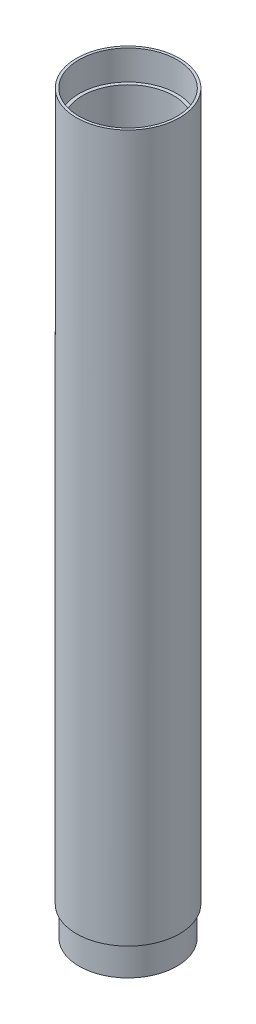
ISO-10303-21;
HEADER;
FILE_DESCRIPTION(('STEP AP214'),'2;1');
FILE_NAME('part.step','',(''),(''),'','','');
FILE_SCHEMA(('AUTOMOTIVE_DESIGN { 1 0 10303 214 1 1 1 1 }'));
ENDSEC;
DATA;
#1=APPLICATION_CONTEXT('core data for automotive mechanical design processes');
#2=APPLICATION_PROTOCOL_DEFINITION('international standard','automotive_design',2000,#1);
#3=PRODUCT_CONTEXT('',#1,'mechanical');
#4=PRODUCT('Part','Part','',(#3));
#5=PRODUCT_RELATED_PRODUCT_CATEGORY('part','',(#4));
#6=PRODUCT_DEFINITION_FORMATION('','',#4);
#7=PRODUCT_DEFINITION_CONTEXT('part definition',#1,'design');
#8=PRODUCT_DEFINITION('design','',#6,#7);
#9=PRODUCT_DEFINITION_SHAPE('','',#8);
#10=(LENGTH_UNIT() NAMED_UNIT(*) SI_UNIT(.MILLI.,.METRE.));
#11=(NAMED_UNIT(*) PLANE_ANGLE_UNIT() SI_UNIT($,.RADIAN.));
#12=(NAMED_UNIT(*) SI_UNIT($,.STERADIAN.) SOLID_ANGLE_UNIT());
#13=UNCERTAINTY_MEASURE_WITH_UNIT(LENGTH_MEASURE(1.E-05),#10,'distance_accuracy_value','');
#14=(GEOMETRIC_REPRESENTATION_CONTEXT(3) GLOBAL_UNCERTAINTY_ASSIGNED_CONTEXT((#13)) GLOBAL_UNIT_ASSIGNED_CONTEXT((#10,
#11,#12)) REPRESENTATION_CONTEXT('',''));
#15=CARTESIAN_POINT('',(0.,0.,0.));
#16=DIRECTION('',(0.,0.,1.));
#17=DIRECTION('',(1.,0.,0.));
#18=AXIS2_PLACEMENT_3D('',#15,#16,#17);
#19=CARTESIAN_POINT('',(0.,0.,0.));
#20=DIRECTION('',(0.,1.,0.));
#21=DIRECTION('',(0.,0.,1.));
#22=AXIS2_PLACEMENT_3D('',#19,#20,#21);
#23=PLANE('',#22);
#24=CARTESIAN_POINT('',(0.,0.,0.));
#25=DIRECTION('',(0.,1.,0.));
#26=DIRECTION('',(0.,0.,1.));
#27=AXIS2_PLACEMENT_3D('',#24,#25,#26);
#28=CIRCLE('',#27,15.5);
#29=CARTESIAN_POINT('',(0.,0.,15.5));
#30=VERTEX_POINT('',#29);
#31=EDGE_CURVE('E53',#30,#30,#28,.T.);
#32=ORIENTED_EDGE('',*,*,#31,.T.);
#33=EDGE_LOOP('',(#32));
#34=FACE_BOUND('',#33,.T.);
#35=CARTESIAN_POINT('',(0.,0.,0.));
#36=DIRECTION('',(0.,-1.,0.));
#37=DIRECTION('',(0.,0.,-1.));
#38=AXIS2_PLACEMENT_3D('',#35,#36,#37);
#39=CIRCLE('',#38,16.6);
#40=CARTESIAN_POINT('',(0.,0.,-16.6));
#41=VERTEX_POINT('',#40);
#42=EDGE_CURVE('E73',#41,#41,#39,.T.);
#43=ORIENTED_EDGE('',*,*,#42,.T.);
#44=EDGE_LOOP('',(#43));
#45=FACE_BOUND('',#44,.T.);
#46=ADVANCED_FACE('F40',(#34,#45),#23,.F.);
#47=CARTESIAN_POINT('',(0.,240.,0.));
#48=DIRECTION('',(0.,-1.,0.));
#49=DIRECTION('',(0.,0.,-1.));
#50=AXIS2_PLACEMENT_3D('',#47,#48,#49);
#51=CYLINDRICAL_SURFACE('',#50,17.5);
#52=CARTESIAN_POINT('',(0.,250.,0.));
#53=DIRECTION('',(0.,1.,0.));
#54=DIRECTION('',(0.,0.,1.));
#55=AXIS2_PLACEMENT_3D('',#52,#53,#54);
#56=CIRCLE('',#55,17.5);
#57=CARTESIAN_POINT('',(0.,250.,17.5));
#58=VERTEX_POINT('',#57);
#59=EDGE_CURVE('E59',#58,#58,#56,.T.);
#60=ORIENTED_EDGE('',*,*,#59,.F.);
#61=EDGE_LOOP('',(#60));
#62=FACE_BOUND('',#61,.T.);
#63=CARTESIAN_POINT('',(0.,10.,0.));
#64=DIRECTION('',(0.,-1.,0.));
#65=DIRECTION('',(0.,0.,-1.));
#66=AXIS2_PLACEMENT_3D('',#63,#64,#65);
#67=CIRCLE('',#66,17.5);
#68=CARTESIAN_POINT('',(0.,10.,-17.5));
#69=VERTEX_POINT('',#68);
#70=EDGE_CURVE('E68',#69,#69,#67,.T.);
#71=ORIENTED_EDGE('',*,*,#70,.F.);
#72=EDGE_LOOP('',(#71));
#73=FACE_BOUND('',#72,.T.);
#74=ADVANCED_FACE('F42',(#62,#73),#51,.T.);
#75=CARTESIAN_POINT('',(0.,240.,0.));
#76=DIRECTION('',(0.,1.,0.));
#77=DIRECTION('',(0.,0.,1.));
#78=AXIS2_PLACEMENT_3D('',#75,#76,#77);
#79=PLANE('',#78);
#80=CARTESIAN_POINT('',(0.,240.,0.));
#81=DIRECTION('',(0.,1.,0.));
#82=DIRECTION('',(0.,0.,1.));
#83=AXIS2_PLACEMENT_3D('',#80,#81,#82);
#84=CIRCLE('',#83,15.5);
#85=CARTESIAN_POINT('',(0.,240.,15.5));
#86=VERTEX_POINT('',#85);
#87=EDGE_CURVE('E48',#86,#86,#84,.T.);
#88=ORIENTED_EDGE('',*,*,#87,.F.);
#89=EDGE_LOOP('',(#88));
#90=FACE_BOUND('',#89,.T.);
#91=CARTESIAN_POINT('',(0.,240.,0.));
#92=DIRECTION('',(0.,1.,0.));
#93=DIRECTION('',(0.,0.,1.));
#94=AXIS2_PLACEMENT_3D('',#91,#92,#93);
#95=CIRCLE('',#94,16.65);
#96=CARTESIAN_POINT('',(0.,240.,16.65));
#97=VERTEX_POINT('',#96);
#98=EDGE_CURVE('E10',#97,#97,#95,.F.);
#99=ORIENTED_EDGE('',*,*,#98,.F.);
#100=EDGE_LOOP('',(#99));
#101=FACE_BOUND('',#100,.T.);
#102=ADVANCED_FACE('F92',(#90,#101),#79,.T.);
#103=CARTESIAN_POINT('',(0.,240.,0.));
#104=DIRECTION('',(0.,-1.,0.));
#105=DIRECTION('',(0.,0.,-1.));
#106=AXIS2_PLACEMENT_3D('',#103,#104,#105);
#107=CYLINDRICAL_SURFACE('',#106,15.5);
#108=ORIENTED_EDGE('',*,*,#87,.T.);
#109=EDGE_LOOP('',(#108));
#110=FACE_BOUND('',#109,.T.);
#111=ORIENTED_EDGE('',*,*,#31,.F.);
#112=EDGE_LOOP('',(#111));
#113=FACE_BOUND('',#112,.T.);
#114=ADVANCED_FACE('F98',(#110,#113),#107,.F.);
#115=CARTESIAN_POINT('',(0.,250.,0.));
#116=DIRECTION('',(0.,1.,0.));
#117=DIRECTION('',(0.,0.,1.));
#118=AXIS2_PLACEMENT_3D('',#115,#116,#117);
#119=PLANE('',#118);
#120=ORIENTED_EDGE('',*,*,#59,.T.);
#121=EDGE_LOOP('',(#120));
#122=FACE_BOUND('',#121,.T.);
#123=CARTESIAN_POINT('',(0.,250.,0.));
#124=DIRECTION('',(0.,1.,0.));
#125=DIRECTION('',(0.,0.,1.));
#126=AXIS2_PLACEMENT_3D('',#123,#124,#125);
#127=CIRCLE('',#126,16.65);
#128=CARTESIAN_POINT('',(0.,250.,16.65));
#129=VERTEX_POINT('',#128);
#130=EDGE_CURVE('E64',#129,#129,#127,.T.);
#131=ORIENTED_EDGE('',*,*,#130,.F.);
#132=EDGE_LOOP('',(#131));
#133=FACE_BOUND('',#132,.T.);
#134=ADVANCED_FACE('F104',(#122,#133),#119,.T.);
#135=CARTESIAN_POINT('',(0.,250.,0.));
#136=DIRECTION('',(0.,-1.,0.));
#137=DIRECTION('',(0.,0.,-1.));
#138=AXIS2_PLACEMENT_3D('',#135,#136,#137);
#139=CYLINDRICAL_SURFACE('',#138,16.65);
#140=ORIENTED_EDGE('',*,*,#130,.T.);
#141=EDGE_LOOP('',(#140));
#142=FACE_BOUND('',#141,.T.);
#143=ORIENTED_EDGE('',*,*,#98,.T.);
#144=EDGE_LOOP('',(#143));
#145=FACE_BOUND('',#144,.T.);
#146=ADVANCED_FACE('F87',(#142,#145),#139,.F.);
#147=CARTESIAN_POINT('',(0.,10.,0.));
#148=DIRECTION('',(0.,-1.,0.));
#149=DIRECTION('',(0.,0.,-1.));
#150=AXIS2_PLACEMENT_3D('',#147,#148,#149);
#151=PLANE('',#150);
#152=CARTESIAN_POINT('',(0.,10.,0.));
#153=DIRECTION('',(0.,-1.,0.));
#154=DIRECTION('',(0.,0.,-1.));
#155=AXIS2_PLACEMENT_3D('',#152,#153,#154);
#156=CIRCLE('',#155,16.6);
#157=CARTESIAN_POINT('',(0.,10.,-16.6));
#158=VERTEX_POINT('',#157);
#159=EDGE_CURVE('E72',#158,#158,#156,.T.);
#160=ORIENTED_EDGE('',*,*,#159,.F.);
#161=EDGE_LOOP('',(#160));
#162=FACE_BOUND('',#161,.T.);
#163=ORIENTED_EDGE('',*,*,#70,.T.);
#164=EDGE_LOOP('',(#163));
#165=FACE_BOUND('',#164,.T.);
#166=ADVANCED_FACE('F84',(#162,#165),#151,.T.);
#167=CARTESIAN_POINT('',(0.,10.,0.));
#168=DIRECTION('',(0.,-1.,0.));
#169=DIRECTION('',(0.,0.,-1.));
#170=AXIS2_PLACEMENT_3D('',#167,#168,#169);
#171=CYLINDRICAL_SURFACE('',#170,16.6);
#172=ORIENTED_EDGE('',*,*,#159,.T.);
#173=EDGE_LOOP('',(#172));
#174=FACE_BOUND('',#173,.T.);
#175=ORIENTED_EDGE('',*,*,#42,.F.);
#176=EDGE_LOOP('',(#175));
#177=FACE_BOUND('',#176,.T.);
#178=ADVANCED_FACE('F81',(#174,#177),#171,.T.);
#179=CLOSED_SHELL('',(#46,#74,#102,#114,#134,#146,#166,#178));
#180=MANIFOLD_SOLID_BREP('B2',#179);
#181=ADVANCED_BREP_SHAPE_REPRESENTATION('',(#18,#180),#14);
#182=SHAPE_DEFINITION_REPRESENTATION(#9,#181);
ENDSEC;
END-ISO-10303-21;
